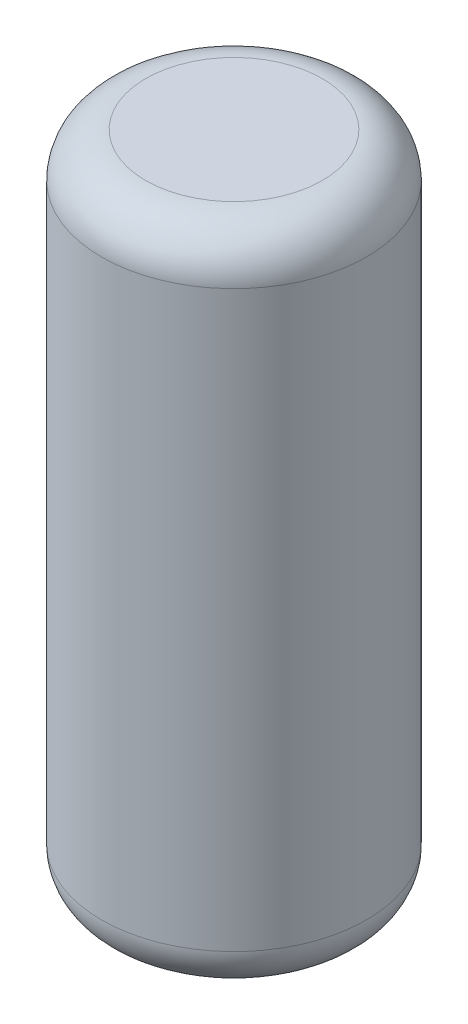
ISO-10303-21;
HEADER;
FILE_DESCRIPTION(('STEP AP214'),'2;1');
FILE_NAME('part.step','',(''),(''),'','','');
FILE_SCHEMA(('AUTOMOTIVE_DESIGN { 1 0 10303 214 1 1 1 1 }'));
ENDSEC;
DATA;
#1=APPLICATION_CONTEXT('core data for automotive mechanical design processes');
#2=APPLICATION_PROTOCOL_DEFINITION('international standard','automotive_design',2000,#1);
#3=PRODUCT_CONTEXT('',#1,'mechanical');
#4=PRODUCT('Part','Part','',(#3));
#5=PRODUCT_RELATED_PRODUCT_CATEGORY('part','',(#4));
#6=PRODUCT_DEFINITION_FORMATION('','',#4);
#7=PRODUCT_DEFINITION_CONTEXT('part definition',#1,'design');
#8=PRODUCT_DEFINITION('design','',#6,#7);
#9=PRODUCT_DEFINITION_SHAPE('','',#8);
#10=(LENGTH_UNIT() NAMED_UNIT(*) SI_UNIT(.MILLI.,.METRE.));
#11=(NAMED_UNIT(*) PLANE_ANGLE_UNIT() SI_UNIT($,.RADIAN.));
#12=(NAMED_UNIT(*) SI_UNIT($,.STERADIAN.) SOLID_ANGLE_UNIT());
#13=UNCERTAINTY_MEASURE_WITH_UNIT(LENGTH_MEASURE(1.E-05),#10,'distance_accuracy_value','');
#14=(GEOMETRIC_REPRESENTATION_CONTEXT(3) GLOBAL_UNCERTAINTY_ASSIGNED_CONTEXT((#13)) GLOBAL_UNIT_ASSIGNED_CONTEXT((#10,
#11,#12)) REPRESENTATION_CONTEXT('',''));
#15=CARTESIAN_POINT('',(0.,0.,0.));
#16=DIRECTION('',(0.,0.,1.));
#17=DIRECTION('',(1.,0.,0.));
#18=AXIS2_PLACEMENT_3D('',#15,#16,#17);
#19=CARTESIAN_POINT('',(0.,9.525,0.));
#20=DIRECTION('',(0.,-1.,0.));
#21=DIRECTION('',(0.,0.,-1.));
#22=AXIS2_PLACEMENT_3D('',#19,#20,#21);
#23=CYLINDRICAL_SURFACE('',#22,3.81);
#24=CARTESIAN_POINT('',(0.,-8.255,0.));
#25=DIRECTION('',(0.,1.,0.));
#26=DIRECTION('',(0.,0.,1.));
#27=AXIS2_PLACEMENT_3D('',#24,#25,#26);
#28=CIRCLE('',#27,3.81);
#29=CARTESIAN_POINT('',(0.,-8.25500000000001,-3.81));
#30=VERTEX_POINT('',#29);
#31=EDGE_CURVE('E50',#30,#30,#28,.T.);
#32=CARTESIAN_POINT('',(0.,8.255,0.));
#33=DIRECTION('',(0.,1.,0.));
#34=DIRECTION('',(0.,0.,1.));
#35=AXIS2_PLACEMENT_3D('',#32,#33,#34);
#36=CIRCLE('',#35,3.81);
#37=CARTESIAN_POINT('',(0.,8.255,-3.81));
#38=VERTEX_POINT('',#37);
#39=EDGE_CURVE('E55',#38,#38,#36,.F.);
#40=CARTESIAN_POINT('',(0.,-8.25500000000001,-3.81));
#41=CARTESIAN_POINT('',(0.,-8.08302083333334,-3.81));
#42=CARTESIAN_POINT('',(0.,-7.91104166666667,-3.81));
#43=CARTESIAN_POINT('',(0.,-7.56708333333334,-3.81));
#44=CARTESIAN_POINT('',(0.,-7.39510416666667,-3.81));
#45=CARTESIAN_POINT('',(0.,-7.05114583333334,-3.81));
#46=CARTESIAN_POINT('',(0.,-6.87916666666667,-3.81));
#47=CARTESIAN_POINT('',(0.,-6.53520833333334,-3.81));
#48=CARTESIAN_POINT('',(0.,-6.36322916666667,-3.81));
#49=CARTESIAN_POINT('',(0.,-6.01927083333334,-3.81));
#50=CARTESIAN_POINT('',(0.,-5.84729166666667,-3.81));
#51=CARTESIAN_POINT('',(0.,-5.50333333333334,-3.81));
#52=CARTESIAN_POINT('',(0.,-5.33135416666667,-3.81));
#53=CARTESIAN_POINT('',(0.,-4.98739583333334,-3.81));
#54=CARTESIAN_POINT('',(0.,-4.81541666666667,-3.81));
#55=CARTESIAN_POINT('',(0.,-4.47145833333334,-3.81));
#56=CARTESIAN_POINT('',(0.,-4.29947916666667,-3.81));
#57=CARTESIAN_POINT('',(0.,-3.95552083333334,-3.81));
#58=CARTESIAN_POINT('',(0.,-3.78354166666667,-3.81));
#59=CARTESIAN_POINT('',(0.,-3.43958333333334,-3.81));
#60=CARTESIAN_POINT('',(0.,-3.26760416666667,-3.81));
#61=CARTESIAN_POINT('',(0.,-2.92364583333334,-3.81));
#62=CARTESIAN_POINT('',(0.,-2.75166666666667,-3.81));
#63=CARTESIAN_POINT('',(0.,-2.40770833333334,-3.81));
#64=CARTESIAN_POINT('',(0.,-2.23572916666667,-3.81));
#65=CARTESIAN_POINT('',(0.,-1.89177083333334,-3.81));
#66=CARTESIAN_POINT('',(0.,-1.71979166666667,-3.81));
#67=CARTESIAN_POINT('',(0.,-1.37583333333334,-3.81));
#68=CARTESIAN_POINT('',(0.,-1.20385416666667,-3.81));
#69=CARTESIAN_POINT('',(0.,-0.859895833333338,-3.81));
#70=CARTESIAN_POINT('',(0.,-0.687916666666671,-3.81));
#71=CARTESIAN_POINT('',(0.,-0.343958333333337,-3.81));
#72=CARTESIAN_POINT('',(0.,-0.17197916666667,-3.81));
#73=CARTESIAN_POINT('',(0.,0.171979166666663,-3.81));
#74=CARTESIAN_POINT('',(0.,0.34395833333333,-3.81));
#75=CARTESIAN_POINT('',(0.,0.687916666666664,-3.81));
#76=CARTESIAN_POINT('',(0.,0.859895833333331,-3.81));
#77=CARTESIAN_POINT('',(0.,1.20385416666666,-3.81));
#78=CARTESIAN_POINT('',(0.,1.37583333333333,-3.81));
#79=CARTESIAN_POINT('',(0.,1.71979166666666,-3.81));
#80=CARTESIAN_POINT('',(0.,1.89177083333333,-3.81));
#81=CARTESIAN_POINT('',(0.,2.23572916666666,-3.81));
#82=CARTESIAN_POINT('',(0.,2.40770833333333,-3.81));
#83=CARTESIAN_POINT('',(0.,2.75166666666666,-3.81));
#84=CARTESIAN_POINT('',(0.,2.92364583333333,-3.81));
#85=CARTESIAN_POINT('',(0.,3.26760416666666,-3.81));
#86=CARTESIAN_POINT('',(0.,3.43958333333333,-3.81));
#87=CARTESIAN_POINT('',(0.,3.78354166666666,-3.81));
#88=CARTESIAN_POINT('',(0.,3.95552083333333,-3.81));
#89=CARTESIAN_POINT('',(0.,4.29947916666667,-3.81));
#90=CARTESIAN_POINT('',(0.,4.47145833333333,-3.81));
#91=CARTESIAN_POINT('',(0.,4.81541666666667,-3.81));
#92=CARTESIAN_POINT('',(0.,4.98739583333333,-3.81));
#93=CARTESIAN_POINT('',(0.,5.33135416666667,-3.81));
#94=CARTESIAN_POINT('',(0.,5.50333333333333,-3.81));
#95=CARTESIAN_POINT('',(0.,5.84729166666666,-3.81));
#96=CARTESIAN_POINT('',(0.,6.01927083333333,-3.81));
#97=CARTESIAN_POINT('',(0.,6.36322916666667,-3.81));
#98=CARTESIAN_POINT('',(0.,6.53520833333333,-3.81));
#99=CARTESIAN_POINT('',(0.,6.87916666666667,-3.81));
#100=CARTESIAN_POINT('',(0.,7.05114583333333,-3.81));
#101=CARTESIAN_POINT('',(0.,7.39510416666667,-3.81));
#102=CARTESIAN_POINT('',(0.,7.56708333333333,-3.81));
#103=CARTESIAN_POINT('',(0.,7.91104166666667,-3.81));
#104=CARTESIAN_POINT('',(0.,8.08302083333333,-3.81));
#105=CARTESIAN_POINT('',(0.,8.255,-3.81));
#106=B_SPLINE_CURVE_WITH_KNOTS('',3,(#40,#41,#42,#43,#44,#45,#46,#47,#48,#49,#50,#51,#52,#53,
#54,#55,#56,#57,#58,#59,#60,#61,#62,#63,#64,#65,#66,#67,#68,#69,#70,#71,#72,#73,#74,#75,#76,#77,
#78,#79,#80,#81,#82,#83,#84,#85,#86,#87,#88,#89,#90,#91,#92,#93,#94,#95,#96,#97,#98,#99,#100,
#101,#102,#103,#104,#105),.UNSPECIFIED.,.F.,.F.,(4,2,2,2,2,2,2,2,2,2,2,2,2,2,2,2,2,2,2,2,2,2,2,
2,2,2,2,2,2,2,2,2,4),(0.,0.515937500000001,1.031875,1.5478125,2.06375,2.5796875,3.095625,
3.6115625,4.1275,4.6434375,5.159375,5.6753125,6.19125,6.7071875,7.223125,7.7390625,8.255,
8.7709375,9.28687500000001,9.8028125,10.31875,10.8346875,11.350625,11.8665625,12.3825,
12.8984375,13.414375,13.9303125,14.44625,14.9621875,15.478125,15.9940625,16.51),.UNSPECIFIED.);
#107=EDGE_CURVE('BSEAM37',#30,#38,#106,.T.);
#108=ORIENTED_EDGE('',*,*,#31,.T.);
#109=ORIENTED_EDGE('',*,*,#39,.T.);
#110=ORIENTED_EDGE('',*,*,#107,.T.);
#111=ORIENTED_EDGE('',*,*,#107,.F.);
#112=EDGE_LOOP('',(#108,#110,#109,#111));
#113=FACE_BOUND('',#112,.T.);
#114=ADVANCED_FACE('F37',(#113),#23,.T.);
#115=CARTESIAN_POINT('',(0.,9.525,0.));
#116=DIRECTION('',(0.,1.,0.));
#117=DIRECTION('',(0.,0.,1.));
#118=AXIS2_PLACEMENT_3D('',#115,#116,#117);
#119=PLANE('',#118);
#120=CARTESIAN_POINT('',(0.,9.525,0.));
#121=DIRECTION('',(0.,1.,0.));
#122=DIRECTION('',(0.,0.,1.));
#123=AXIS2_PLACEMENT_3D('',#120,#121,#122);
#124=CIRCLE('',#123,2.54);
#125=CARTESIAN_POINT('',(0.,9.525,2.54));
#126=VERTEX_POINT('',#125);
#127=EDGE_CURVE('E10',#126,#126,#124,.T.);
#128=ORIENTED_EDGE('',*,*,#127,.T.);
#129=EDGE_LOOP('',(#128));
#130=FACE_BOUND('',#129,.T.);
#131=ADVANCED_FACE('F72',(#130),#119,.T.);
#132=CARTESIAN_POINT('',(0.,-9.525,0.));
#133=DIRECTION('',(0.,1.,0.));
#134=DIRECTION('',(0.,0.,1.));
#135=AXIS2_PLACEMENT_3D('',#132,#133,#134);
#136=PLANE('',#135);
#137=CARTESIAN_POINT('',(0.,-9.525,0.));
#138=DIRECTION('',(0.,1.,0.));
#139=DIRECTION('',(0.,0.,1.));
#140=AXIS2_PLACEMENT_3D('',#137,#138,#139);
#141=CIRCLE('',#140,2.54);
#142=CARTESIAN_POINT('',(0.,-9.525,2.54));
#143=VERTEX_POINT('',#142);
#144=EDGE_CURVE('E45',#143,#143,#141,.F.);
#145=ORIENTED_EDGE('',*,*,#144,.T.);
#146=EDGE_LOOP('',(#145));
#147=FACE_BOUND('',#146,.T.);
#148=ADVANCED_FACE('F69',(#147),#136,.F.);
#149=CARTESIAN_POINT('',(0.,-8.255,0.));
#150=DIRECTION('',(0.,1.,0.));
#151=DIRECTION('',(0.,0.,1.));
#152=AXIS2_PLACEMENT_3D('',#149,#150,#151);
#153=TOROIDAL_SURFACE('',#152,2.54,1.27);
#154=ORIENTED_EDGE('',*,*,#144,.F.);
#155=EDGE_LOOP('',(#154));
#156=FACE_BOUND('',#155,.T.);
#157=ORIENTED_EDGE('',*,*,#31,.F.);
#158=EDGE_LOOP('',(#157));
#159=FACE_BOUND('',#158,.T.);
#160=ADVANCED_FACE('F65',(#156,#159),#153,.T.);
#161=CARTESIAN_POINT('',(0.,8.255,0.));
#162=DIRECTION('',(0.,1.,0.));
#163=DIRECTION('',(0.,0.,1.));
#164=AXIS2_PLACEMENT_3D('',#161,#162,#163);
#165=TOROIDAL_SURFACE('',#164,2.54,1.27);
#166=ORIENTED_EDGE('',*,*,#39,.F.);
#167=EDGE_LOOP('',(#166));
#168=FACE_BOUND('',#167,.T.);
#169=ORIENTED_EDGE('',*,*,#127,.F.);
#170=EDGE_LOOP('',(#169));
#171=FACE_BOUND('',#170,.T.);
#172=ADVANCED_FACE('F39',(#168,#171),#165,.T.);
#173=CLOSED_SHELL('',(#114,#131,#148,#160,#172));
#174=MANIFOLD_SOLID_BREP('B2',#173);
#175=ADVANCED_BREP_SHAPE_REPRESENTATION('',(#18,#174),#14);
#176=SHAPE_DEFINITION_REPRESENTATION(#9,#175);
ENDSEC;
END-ISO-10303-21;
